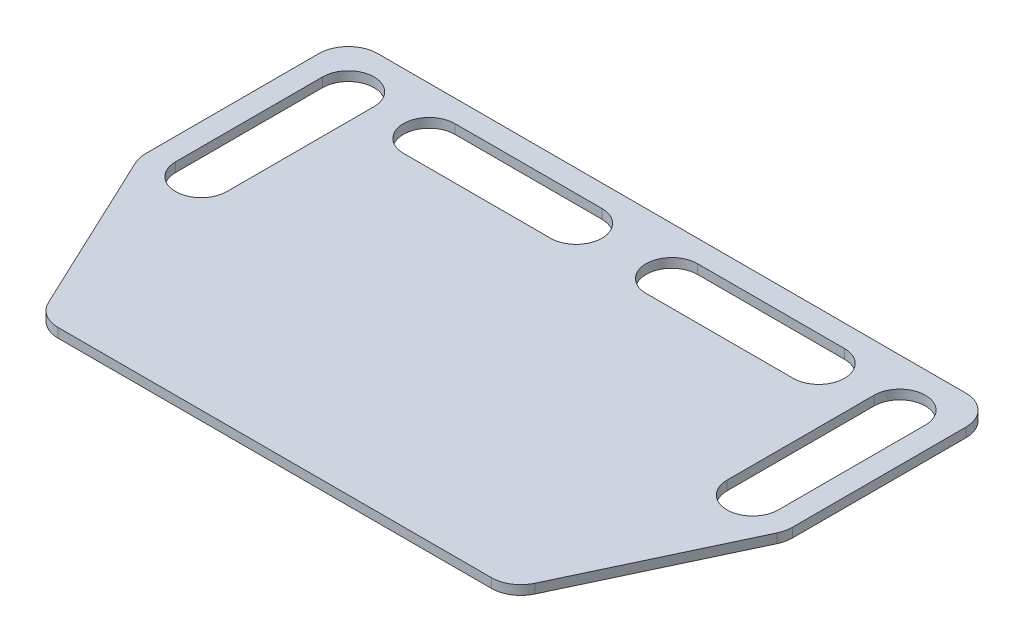
ISO-10303-21;
HEADER;
FILE_DESCRIPTION(('STEP AP214'),'2;1');
FILE_NAME('part.step','',(''),(''),'','','');
FILE_SCHEMA(('AUTOMOTIVE_DESIGN { 1 0 10303 214 1 1 1 1 }'));
ENDSEC;
DATA;
#1=APPLICATION_CONTEXT('core data for automotive mechanical design processes');
#2=APPLICATION_PROTOCOL_DEFINITION('international standard','automotive_design',2000,#1);
#3=PRODUCT_CONTEXT('',#1,'mechanical');
#4=PRODUCT('Part','Part','',(#3));
#5=PRODUCT_RELATED_PRODUCT_CATEGORY('part','',(#4));
#6=PRODUCT_DEFINITION_FORMATION('','',#4);
#7=PRODUCT_DEFINITION_CONTEXT('part definition',#1,'design');
#8=PRODUCT_DEFINITION('design','',#6,#7);
#9=PRODUCT_DEFINITION_SHAPE('','',#8);
#10=(LENGTH_UNIT() NAMED_UNIT(*) SI_UNIT(.MILLI.,.METRE.));
#11=(NAMED_UNIT(*) PLANE_ANGLE_UNIT() SI_UNIT($,.RADIAN.));
#12=(NAMED_UNIT(*) SI_UNIT($,.STERADIAN.) SOLID_ANGLE_UNIT());
#13=UNCERTAINTY_MEASURE_WITH_UNIT(LENGTH_MEASURE(1.E-05),#10,'distance_accuracy_value','');
#14=(GEOMETRIC_REPRESENTATION_CONTEXT(3) GLOBAL_UNCERTAINTY_ASSIGNED_CONTEXT((#13)) GLOBAL_UNIT_ASSIGNED_CONTEXT((#10,
#11,#12)) REPRESENTATION_CONTEXT('',''));
#15=CARTESIAN_POINT('',(0.,0.,0.));
#16=DIRECTION('',(0.,0.,1.));
#17=DIRECTION('',(1.,0.,0.));
#18=AXIS2_PLACEMENT_3D('',#15,#16,#17);
#19=CARTESIAN_POINT('',(-200.,6.35,-21.97073557014));
#20=DIRECTION('',(0.,-1.,0.));
#21=DIRECTION('',(0.,0.,-1.));
#22=AXIS2_PLACEMENT_3D('',#19,#20,#21);
#23=PLANE('',#22);
#24=CARTESIAN_POINT('',(187.5,6.35,-127.5));
#25=DIRECTION('',(0.,1.,0.));
#26=DIRECTION('',(0.,0.,1.));
#27=AXIS2_PLACEMENT_3D('',#24,#25,#26);
#28=CIRCLE('',#27,17.5);
#29=CARTESIAN_POINT('',(205.,6.35,-127.5));
#30=VERTEX_POINT('',#29);
#31=CARTESIAN_POINT('',(170.,6.35,-127.5));
#32=VERTEX_POINT('',#31);
#33=EDGE_CURVE('E254',#30,#32,#28,.T.);
#34=ORIENTED_EDGE('',*,*,#33,.F.);
#35=DIRECTION('',(0.,0.,-1.));
#36=VECTOR('',#35,1.);
#37=CARTESIAN_POINT('',(205.,6.35,-127.5));
#38=LINE('',#37,#36);
#39=CARTESIAN_POINT('',(205.,6.35,-27.5000000000001));
#40=VERTEX_POINT('',#39);
#41=EDGE_CURVE('E262',#40,#30,#38,.T.);
#42=ORIENTED_EDGE('',*,*,#41,.F.);
#43=CARTESIAN_POINT('',(187.5,6.35,-27.5000000000001));
#44=DIRECTION('',(0.,1.,0.));
#45=DIRECTION('',(0.,0.,1.));
#46=AXIS2_PLACEMENT_3D('',#43,#44,#45);
#47=CIRCLE('',#46,17.5);
#48=CARTESIAN_POINT('',(170.,6.35,-27.5000000000001));
#49=VERTEX_POINT('',#48);
#50=EDGE_CURVE('E259',#49,#40,#47,.T.);
#51=ORIENTED_EDGE('',*,*,#50,.F.);
#52=DIRECTION('',(0.,0.,1.));
#53=VECTOR('',#52,1.);
#54=CARTESIAN_POINT('',(170.,6.35,-127.5));
#55=LINE('',#54,#53);
#56=EDGE_CURVE('E256',#32,#49,#55,.T.);
#57=ORIENTED_EDGE('',*,*,#56,.F.);
#58=EDGE_LOOP('',(#34,#42,#51,#57));
#59=FACE_BOUND('',#58,.T.);
#60=CARTESIAN_POINT('',(-187.5,6.35,-127.5));
#61=DIRECTION('',(0.,1.,0.));
#62=DIRECTION('',(0.,0.,1.));
#63=AXIS2_PLACEMENT_3D('',#60,#61,#62);
#64=CIRCLE('',#63,17.5);
#65=CARTESIAN_POINT('',(-170.,6.35,-127.5));
#66=VERTEX_POINT('',#65);
#67=CARTESIAN_POINT('',(-205.,6.35,-127.5));
#68=VERTEX_POINT('',#67);
#69=EDGE_CURVE('E316',#66,#68,#64,.T.);
#70=ORIENTED_EDGE('',*,*,#69,.F.);
#71=DIRECTION('',(0.,0.,-1.));
#72=VECTOR('',#71,1.);
#73=CARTESIAN_POINT('',(-170.,6.35,-127.5));
#74=LINE('',#73,#72);
#75=CARTESIAN_POINT('',(-170.,6.35,-27.5000000000001));
#76=VERTEX_POINT('',#75);
#77=EDGE_CURVE('E324',#76,#66,#74,.T.);
#78=ORIENTED_EDGE('',*,*,#77,.F.);
#79=CARTESIAN_POINT('',(-187.5,6.35,-27.5000000000001));
#80=DIRECTION('',(0.,1.,0.));
#81=DIRECTION('',(0.,0.,1.));
#82=AXIS2_PLACEMENT_3D('',#79,#80,#81);
#83=CIRCLE('',#82,17.5);
#84=CARTESIAN_POINT('',(-205.,6.35,-27.5000000000002));
#85=VERTEX_POINT('',#84);
#86=EDGE_CURVE('E321',#85,#76,#83,.T.);
#87=ORIENTED_EDGE('',*,*,#86,.F.);
#88=DIRECTION('',(0.,0.,1.));
#89=VECTOR('',#88,1.);
#90=CARTESIAN_POINT('',(-205.,6.35,-127.5));
#91=LINE('',#90,#89);
#92=EDGE_CURVE('E318',#68,#85,#91,.T.);
#93=ORIENTED_EDGE('',*,*,#92,.F.);
#94=EDGE_LOOP('',(#70,#78,#87,#93));
#95=FACE_BOUND('',#94,.T.);
#96=CARTESIAN_POINT('',(-200.,6.35,-21.97073557014));
#97=DIRECTION('',(0.,1.,0.));
#98=DIRECTION('',(0.,0.,-1.));
#99=AXIS2_PLACEMENT_3D('',#96,#97,#98);
#100=CIRCLE('',#99,20.);
#101=CARTESIAN_POINT('',(-220.,6.35,-21.97073557014));
#102=VERTEX_POINT('',#101);
#103=CARTESIAN_POINT('',(-218.09637404402,6.35,-13.4547948435424));
#104=VERTEX_POINT('',#103);
#105=EDGE_CURVE('E347',#102,#104,#100,.T.);
#106=ORIENTED_EDGE('',*,*,#105,.T.);
#107=DIRECTION('',(0.42579703632988,0.,0.904818702200994));
#108=VECTOR('',#107,1.);
#109=CARTESIAN_POINT('',(-165.404263187483,6.35,98.5159407265976));
#110=LINE('',#109,#108);
#111=CARTESIAN_POINT('',(-165.404263187483,6.35,98.5159407265976));
#112=VERTEX_POINT('',#111);
#113=EDGE_CURVE('E350',#104,#112,#110,.T.);
#114=ORIENTED_EDGE('',*,*,#113,.T.);
#115=CARTESIAN_POINT('',(-147.307889143464,6.35,90.));
#116=DIRECTION('',(0.,1.,0.));
#117=DIRECTION('',(0.,0.,-1.));
#118=AXIS2_PLACEMENT_3D('',#115,#116,#117);
#119=CIRCLE('',#118,20.);
#120=CARTESIAN_POINT('',(-147.307889143464,6.35,110.));
#121=VERTEX_POINT('',#120);
#122=EDGE_CURVE('E353',#112,#121,#119,.T.);
#123=ORIENTED_EDGE('',*,*,#122,.T.);
#124=DIRECTION('',(1.,0.,0.));
#125=VECTOR('',#124,1.);
#126=CARTESIAN_POINT('',(-147.307889143464,6.35,110.));
#127=LINE('',#126,#125);
#128=CARTESIAN_POINT('',(147.307889143464,6.35,110.));
#129=VERTEX_POINT('',#128);
#130=EDGE_CURVE('E355',#121,#129,#127,.T.);
#131=ORIENTED_EDGE('',*,*,#130,.T.);
#132=CARTESIAN_POINT('',(147.307889143464,6.35,90.));
#133=DIRECTION('',(0.,1.,0.));
#134=DIRECTION('',(0.,0.,-1.));
#135=AXIS2_PLACEMENT_3D('',#132,#133,#134);
#136=CIRCLE('',#135,20.);
#137=CARTESIAN_POINT('',(165.404263187483,6.35,98.5159407265976));
#138=VERTEX_POINT('',#137);
#139=EDGE_CURVE('E357',#129,#138,#136,.T.);
#140=ORIENTED_EDGE('',*,*,#139,.T.);
#141=DIRECTION('',(0.425797036329881,0.,-0.904818702200993));
#142=VECTOR('',#141,1.);
#143=CARTESIAN_POINT('',(165.404263187483,6.35,98.5159407265976));
#144=LINE('',#143,#142);
#145=CARTESIAN_POINT('',(218.09637404402,6.35,-13.4547948435424));
#146=VERTEX_POINT('',#145);
#147=EDGE_CURVE('E359',#138,#146,#144,.T.);
#148=ORIENTED_EDGE('',*,*,#147,.T.);
#149=CARTESIAN_POINT('',(200.,6.35,-21.9707355701401));
#150=DIRECTION('',(0.,1.,0.));
#151=DIRECTION('',(0.,0.,-1.));
#152=AXIS2_PLACEMENT_3D('',#149,#150,#151);
#153=CIRCLE('',#152,20.);
#154=CARTESIAN_POINT('',(220.,6.35,-21.9707355701401));
#155=VERTEX_POINT('',#154);
#156=EDGE_CURVE('E361',#146,#155,#153,.T.);
#157=ORIENTED_EDGE('',*,*,#156,.T.);
#158=DIRECTION('',(0.,0.,-1.));
#159=VECTOR('',#158,1.);
#160=CARTESIAN_POINT('',(220.,6.35,-21.9707355701401));
#161=LINE('',#160,#159);
#162=CARTESIAN_POINT('',(220.,6.35,-140.));
#163=VERTEX_POINT('',#162);
#164=EDGE_CURVE('E363',#155,#163,#161,.T.);
#165=ORIENTED_EDGE('',*,*,#164,.T.);
#166=CARTESIAN_POINT('',(200.,6.35,-140.));
#167=DIRECTION('',(0.,1.,0.));
#168=DIRECTION('',(0.,0.,1.));
#169=AXIS2_PLACEMENT_3D('',#166,#167,#168);
#170=CIRCLE('',#169,20.);
#171=CARTESIAN_POINT('',(200.,6.35,-160.));
#172=VERTEX_POINT('',#171);
#173=EDGE_CURVE('E365',#163,#172,#170,.T.);
#174=ORIENTED_EDGE('',*,*,#173,.T.);
#175=DIRECTION('',(-1.,0.,0.));
#176=VECTOR('',#175,1.);
#177=CARTESIAN_POINT('',(-200.,6.35,-160.));
#178=LINE('',#177,#176);
#179=CARTESIAN_POINT('',(-200.,6.35,-160.));
#180=VERTEX_POINT('',#179);
#181=EDGE_CURVE('E367',#172,#180,#178,.T.);
#182=ORIENTED_EDGE('',*,*,#181,.T.);
#183=CARTESIAN_POINT('',(-200.,6.35,-140.));
#184=DIRECTION('',(0.,1.,0.));
#185=DIRECTION('',(0.,0.,-1.));
#186=AXIS2_PLACEMENT_3D('',#183,#184,#185);
#187=CIRCLE('',#186,20.);
#188=CARTESIAN_POINT('',(-220.,6.35,-140.));
#189=VERTEX_POINT('',#188);
#190=EDGE_CURVE('E369',#180,#189,#187,.T.);
#191=ORIENTED_EDGE('',*,*,#190,.T.);
#192=DIRECTION('',(0.,0.,1.));
#193=VECTOR('',#192,1.);
#194=CARTESIAN_POINT('',(-220.,6.35,-21.97073557014));
#195=LINE('',#194,#193);
#196=EDGE_CURVE('E371',#189,#102,#195,.T.);
#197=ORIENTED_EDGE('',*,*,#196,.T.);
#198=EDGE_LOOP('',(#106,#114,#123,#131,#140,#148,#157,#165,#174,#182,#191,#197));
#199=FACE_BOUND('',#198,.T.);
#200=CARTESIAN_POINT('',(-132.5,6.35,-127.5));
#201=DIRECTION('',(0.,1.,0.));
#202=DIRECTION('',(0.,0.,1.));
#203=AXIS2_PLACEMENT_3D('',#200,#201,#202);
#204=CIRCLE('',#203,17.5000000000001);
#205=CARTESIAN_POINT('',(-132.5,6.35,-145.));
#206=VERTEX_POINT('',#205);
#207=CARTESIAN_POINT('',(-132.5,6.35,-110.));
#208=VERTEX_POINT('',#207);
#209=EDGE_CURVE('E285',#206,#208,#204,.T.);
#210=ORIENTED_EDGE('',*,*,#209,.F.);
#211=DIRECTION('',(-1.,0.,0.));
#212=VECTOR('',#211,1.);
#213=CARTESIAN_POINT('',(-132.5,6.35,-145.));
#214=LINE('',#213,#212);
#215=CARTESIAN_POINT('',(-32.4999999999999,6.35,-145.));
#216=VERTEX_POINT('',#215);
#217=EDGE_CURVE('E293',#216,#206,#214,.T.);
#218=ORIENTED_EDGE('',*,*,#217,.F.);
#219=CARTESIAN_POINT('',(-32.4999999999999,6.35,-127.5));
#220=DIRECTION('',(0.,1.,0.));
#221=DIRECTION('',(0.,0.,1.));
#222=AXIS2_PLACEMENT_3D('',#219,#220,#221);
#223=CIRCLE('',#222,17.5000000000001);
#224=CARTESIAN_POINT('',(-32.4999999999999,6.35,-110.));
#225=VERTEX_POINT('',#224);
#226=EDGE_CURVE('E290',#225,#216,#223,.T.);
#227=ORIENTED_EDGE('',*,*,#226,.F.);
#228=DIRECTION('',(1.,0.,0.));
#229=VECTOR('',#228,1.);
#230=CARTESIAN_POINT('',(-132.5,6.35,-110.));
#231=LINE('',#230,#229);
#232=EDGE_CURVE('E287',#208,#225,#231,.T.);
#233=ORIENTED_EDGE('',*,*,#232,.F.);
#234=EDGE_LOOP('',(#210,#218,#227,#233));
#235=FACE_BOUND('',#234,.T.);
#236=CARTESIAN_POINT('',(32.5000000000001,6.35,-127.5));
#237=DIRECTION('',(0.,1.,0.));
#238=DIRECTION('',(0.,0.,1.));
#239=AXIS2_PLACEMENT_3D('',#236,#237,#238);
#240=CIRCLE('',#239,17.5);
#241=CARTESIAN_POINT('',(32.5000000000001,6.35,-145.));
#242=VERTEX_POINT('',#241);
#243=CARTESIAN_POINT('',(32.5000000000001,6.35,-110.));
#244=VERTEX_POINT('',#243);
#245=EDGE_CURVE('E218',#242,#244,#240,.T.);
#246=ORIENTED_EDGE('',*,*,#245,.F.);
#247=DIRECTION('',(-1.,0.,0.));
#248=VECTOR('',#247,1.);
#249=CARTESIAN_POINT('',(32.5000000000001,6.35,-145.));
#250=LINE('',#249,#248);
#251=CARTESIAN_POINT('',(132.5,6.35,-145.));
#252=VERTEX_POINT('',#251);
#253=EDGE_CURVE('E240',#252,#242,#250,.T.);
#254=ORIENTED_EDGE('',*,*,#253,.F.);
#255=CARTESIAN_POINT('',(132.5,6.35,-127.5));
#256=DIRECTION('',(0.,1.,0.));
#257=DIRECTION('',(0.,0.,1.));
#258=AXIS2_PLACEMENT_3D('',#255,#256,#257);
#259=CIRCLE('',#258,17.5);
#260=CARTESIAN_POINT('',(132.5,6.35,-110.));
#261=VERTEX_POINT('',#260);
#262=EDGE_CURVE('E238',#261,#252,#259,.T.);
#263=ORIENTED_EDGE('',*,*,#262,.F.);
#264=DIRECTION('',(1.,0.,0.));
#265=VECTOR('',#264,1.);
#266=CARTESIAN_POINT('',(32.5000000000001,6.35,-110.));
#267=LINE('',#266,#265);
#268=EDGE_CURVE('E226',#244,#261,#267,.T.);
#269=ORIENTED_EDGE('',*,*,#268,.F.);
#270=EDGE_LOOP('',(#246,#254,#263,#269));
#271=FACE_BOUND('',#270,.T.);
#272=ADVANCED_FACE('F33',(#59,#95,#199,#235,#271),#23,.F.);
#273=CARTESIAN_POINT('',(-200.,0.,-21.97073557014));
#274=DIRECTION('',(0.,-1.,0.));
#275=DIRECTION('',(0.,0.,-1.));
#276=AXIS2_PLACEMENT_3D('',#273,#274,#275);
#277=PLANE('',#276);
#278=DIRECTION('',(0.,0.,-1.));
#279=VECTOR('',#278,1.);
#280=CARTESIAN_POINT('',(205.,0.,-127.5));
#281=LINE('',#280,#279);
#282=CARTESIAN_POINT('',(205.,0.,-27.5000000000001));
#283=VERTEX_POINT('',#282);
#284=CARTESIAN_POINT('',(205.,0.,-127.5));
#285=VERTEX_POINT('',#284);
#286=EDGE_CURVE('E257',#283,#285,#281,.T.);
#287=ORIENTED_EDGE('',*,*,#286,.T.);
#288=CARTESIAN_POINT('',(187.5,0.,-127.5));
#289=DIRECTION('',(0.,1.,0.));
#290=DIRECTION('',(0.,0.,1.));
#291=AXIS2_PLACEMENT_3D('',#288,#289,#290);
#292=CIRCLE('',#291,17.5);
#293=CARTESIAN_POINT('',(170.,0.,-127.5));
#294=VERTEX_POINT('',#293);
#295=EDGE_CURVE('E234',#285,#294,#292,.T.);
#296=ORIENTED_EDGE('',*,*,#295,.T.);
#297=DIRECTION('',(0.,0.,1.));
#298=VECTOR('',#297,1.);
#299=CARTESIAN_POINT('',(170.,0.,-127.5));
#300=LINE('',#299,#298);
#301=CARTESIAN_POINT('',(170.,0.,-27.5000000000001));
#302=VERTEX_POINT('',#301);
#303=EDGE_CURVE('E267',#294,#302,#300,.T.);
#304=ORIENTED_EDGE('',*,*,#303,.T.);
#305=CARTESIAN_POINT('',(187.5,0.,-27.5000000000001));
#306=DIRECTION('',(0.,1.,0.));
#307=DIRECTION('',(0.,0.,1.));
#308=AXIS2_PLACEMENT_3D('',#305,#306,#307);
#309=CIRCLE('',#308,17.5);
#310=EDGE_CURVE('E270',#302,#283,#309,.T.);
#311=ORIENTED_EDGE('',*,*,#310,.T.);
#312=EDGE_LOOP('',(#287,#296,#304,#311));
#313=FACE_BOUND('',#312,.T.);
#314=DIRECTION('',(0.,0.,-1.));
#315=VECTOR('',#314,1.);
#316=CARTESIAN_POINT('',(-170.,0.,-127.5));
#317=LINE('',#316,#315);
#318=CARTESIAN_POINT('',(-170.,0.,-27.5000000000001));
#319=VERTEX_POINT('',#318);
#320=CARTESIAN_POINT('',(-170.,0.,-127.5));
#321=VERTEX_POINT('',#320);
#322=EDGE_CURVE('E319',#319,#321,#317,.T.);
#323=ORIENTED_EDGE('',*,*,#322,.T.);
#324=CARTESIAN_POINT('',(-187.5,0.,-127.5));
#325=DIRECTION('',(0.,1.,0.));
#326=DIRECTION('',(0.,0.,1.));
#327=AXIS2_PLACEMENT_3D('',#324,#325,#326);
#328=CIRCLE('',#327,17.5);
#329=CARTESIAN_POINT('',(-205.,0.,-127.5));
#330=VERTEX_POINT('',#329);
#331=EDGE_CURVE('E315',#321,#330,#328,.T.);
#332=ORIENTED_EDGE('',*,*,#331,.T.);
#333=DIRECTION('',(0.,0.,1.));
#334=VECTOR('',#333,1.);
#335=CARTESIAN_POINT('',(-205.,0.,-127.5));
#336=LINE('',#335,#334);
#337=CARTESIAN_POINT('',(-205.,0.,-27.5000000000002));
#338=VERTEX_POINT('',#337);
#339=EDGE_CURVE('E329',#330,#338,#336,.T.);
#340=ORIENTED_EDGE('',*,*,#339,.T.);
#341=CARTESIAN_POINT('',(-187.5,0.,-27.5000000000001));
#342=DIRECTION('',(0.,1.,0.));
#343=DIRECTION('',(0.,0.,1.));
#344=AXIS2_PLACEMENT_3D('',#341,#342,#343);
#345=CIRCLE('',#344,17.5);
#346=EDGE_CURVE('E332',#338,#319,#345,.T.);
#347=ORIENTED_EDGE('',*,*,#346,.T.);
#348=EDGE_LOOP('',(#323,#332,#340,#347));
#349=FACE_BOUND('',#348,.T.);
#350=CARTESIAN_POINT('',(-200.,0.,-21.97073557014));
#351=DIRECTION('',(0.,1.,0.));
#352=DIRECTION('',(0.,0.,-1.));
#353=AXIS2_PLACEMENT_3D('',#350,#351,#352);
#354=CIRCLE('',#353,20.);
#355=CARTESIAN_POINT('',(-220.,0.,-21.97073557014));
#356=VERTEX_POINT('',#355);
#357=CARTESIAN_POINT('',(-218.09637404402,0.,-13.4547948435424));
#358=VERTEX_POINT('',#357);
#359=EDGE_CURVE('E346',#356,#358,#354,.T.);
#360=ORIENTED_EDGE('',*,*,#359,.F.);
#361=DIRECTION('',(0.,0.,1.));
#362=VECTOR('',#361,1.);
#363=CARTESIAN_POINT('',(-220.,0.,-21.97073557014));
#364=LINE('',#363,#362);
#365=CARTESIAN_POINT('',(-220.,0.,-140.));
#366=VERTEX_POINT('',#365);
#367=EDGE_CURVE('E351',#366,#356,#364,.T.);
#368=ORIENTED_EDGE('',*,*,#367,.F.);
#369=CARTESIAN_POINT('',(-200.,0.,-140.));
#370=DIRECTION('',(0.,1.,0.));
#371=DIRECTION('',(0.,0.,-1.));
#372=AXIS2_PLACEMENT_3D('',#369,#370,#371);
#373=CIRCLE('',#372,20.);
#374=CARTESIAN_POINT('',(-200.,0.,-160.));
#375=VERTEX_POINT('',#374);
#376=EDGE_CURVE('E394',#375,#366,#373,.T.);
#377=ORIENTED_EDGE('',*,*,#376,.F.);
#378=DIRECTION('',(-1.,0.,0.));
#379=VECTOR('',#378,1.);
#380=CARTESIAN_POINT('',(-200.,0.,-160.));
#381=LINE('',#380,#379);
#382=CARTESIAN_POINT('',(200.,0.,-160.));
#383=VERTEX_POINT('',#382);
#384=EDGE_CURVE('E392',#383,#375,#381,.T.);
#385=ORIENTED_EDGE('',*,*,#384,.F.);
#386=CARTESIAN_POINT('',(200.,0.,-140.));
#387=DIRECTION('',(0.,1.,0.));
#388=DIRECTION('',(0.,0.,1.));
#389=AXIS2_PLACEMENT_3D('',#386,#387,#388);
#390=CIRCLE('',#389,20.);
#391=CARTESIAN_POINT('',(220.,0.,-140.));
#392=VERTEX_POINT('',#391);
#393=EDGE_CURVE('E390',#392,#383,#390,.T.);
#394=ORIENTED_EDGE('',*,*,#393,.F.);
#395=DIRECTION('',(0.,0.,-1.));
#396=VECTOR('',#395,1.);
#397=CARTESIAN_POINT('',(220.,0.,-21.9707355701401));
#398=LINE('',#397,#396);
#399=CARTESIAN_POINT('',(220.,0.,-21.9707355701401));
#400=VERTEX_POINT('',#399);
#401=EDGE_CURVE('E388',#400,#392,#398,.T.);
#402=ORIENTED_EDGE('',*,*,#401,.F.);
#403=CARTESIAN_POINT('',(200.,0.,-21.9707355701401));
#404=DIRECTION('',(0.,1.,0.));
#405=DIRECTION('',(0.,0.,-1.));
#406=AXIS2_PLACEMENT_3D('',#403,#404,#405);
#407=CIRCLE('',#406,20.);
#408=CARTESIAN_POINT('',(218.09637404402,0.,-13.4547948435424));
#409=VERTEX_POINT('',#408);
#410=EDGE_CURVE('E386',#409,#400,#407,.T.);
#411=ORIENTED_EDGE('',*,*,#410,.F.);
#412=DIRECTION('',(0.425797036329881,0.,-0.904818702200993));
#413=VECTOR('',#412,1.);
#414=CARTESIAN_POINT('',(165.404263187483,0.,98.5159407265976));
#415=LINE('',#414,#413);
#416=CARTESIAN_POINT('',(165.404263187483,0.,98.5159407265976));
#417=VERTEX_POINT('',#416);
#418=EDGE_CURVE('E384',#417,#409,#415,.T.);
#419=ORIENTED_EDGE('',*,*,#418,.F.);
#420=CARTESIAN_POINT('',(147.307889143464,0.,90.));
#421=DIRECTION('',(0.,1.,0.));
#422=DIRECTION('',(0.,0.,-1.));
#423=AXIS2_PLACEMENT_3D('',#420,#421,#422);
#424=CIRCLE('',#423,20.);
#425=CARTESIAN_POINT('',(147.307889143464,0.,110.));
#426=VERTEX_POINT('',#425);
#427=EDGE_CURVE('E382',#426,#417,#424,.T.);
#428=ORIENTED_EDGE('',*,*,#427,.F.);
#429=DIRECTION('',(1.,0.,0.));
#430=VECTOR('',#429,1.);
#431=CARTESIAN_POINT('',(-147.307889143464,0.,110.));
#432=LINE('',#431,#430);
#433=CARTESIAN_POINT('',(-147.307889143464,0.,110.));
#434=VERTEX_POINT('',#433);
#435=EDGE_CURVE('E380',#434,#426,#432,.T.);
#436=ORIENTED_EDGE('',*,*,#435,.F.);
#437=CARTESIAN_POINT('',(-147.307889143464,0.,90.));
#438=DIRECTION('',(0.,1.,0.));
#439=DIRECTION('',(0.,0.,-1.));
#440=AXIS2_PLACEMENT_3D('',#437,#438,#439);
#441=CIRCLE('',#440,20.);
#442=CARTESIAN_POINT('',(-165.404263187483,0.,98.5159407265976));
#443=VERTEX_POINT('',#442);
#444=EDGE_CURVE('E378',#443,#434,#441,.T.);
#445=ORIENTED_EDGE('',*,*,#444,.F.);
#446=DIRECTION('',(0.42579703632988,0.,0.904818702200994));
#447=VECTOR('',#446,1.);
#448=CARTESIAN_POINT('',(-165.404263187483,0.,98.5159407265976));
#449=LINE('',#448,#447);
#450=EDGE_CURVE('E376',#358,#443,#449,.T.);
#451=ORIENTED_EDGE('',*,*,#450,.F.);
#452=EDGE_LOOP('',(#360,#368,#377,#385,#394,#402,#411,#419,#428,#436,#445,#451));
#453=FACE_BOUND('',#452,.T.);
#454=DIRECTION('',(-1.,0.,0.));
#455=VECTOR('',#454,1.);
#456=CARTESIAN_POINT('',(-132.5,0.,-145.));
#457=LINE('',#456,#455);
#458=CARTESIAN_POINT('',(-32.4999999999999,0.,-145.));
#459=VERTEX_POINT('',#458);
#460=CARTESIAN_POINT('',(-132.5,0.,-145.));
#461=VERTEX_POINT('',#460);
#462=EDGE_CURVE('E288',#459,#461,#457,.T.);
#463=ORIENTED_EDGE('',*,*,#462,.T.);
#464=CARTESIAN_POINT('',(-132.5,0.,-127.5));
#465=DIRECTION('',(0.,1.,0.));
#466=DIRECTION('',(0.,0.,1.));
#467=AXIS2_PLACEMENT_3D('',#464,#465,#466);
#468=CIRCLE('',#467,17.5000000000001);
#469=CARTESIAN_POINT('',(-132.5,0.,-110.));
#470=VERTEX_POINT('',#469);
#471=EDGE_CURVE('E284',#461,#470,#468,.T.);
#472=ORIENTED_EDGE('',*,*,#471,.T.);
#473=DIRECTION('',(1.,0.,0.));
#474=VECTOR('',#473,1.);
#475=CARTESIAN_POINT('',(-132.5,0.,-110.));
#476=LINE('',#475,#474);
#477=CARTESIAN_POINT('',(-32.4999999999999,0.,-110.));
#478=VERTEX_POINT('',#477);
#479=EDGE_CURVE('E298',#470,#478,#476,.T.);
#480=ORIENTED_EDGE('',*,*,#479,.T.);
#481=CARTESIAN_POINT('',(-32.4999999999999,0.,-127.5));
#482=DIRECTION('',(0.,1.,0.));
#483=DIRECTION('',(0.,0.,1.));
#484=AXIS2_PLACEMENT_3D('',#481,#482,#483);
#485=CIRCLE('',#484,17.5000000000001);
#486=EDGE_CURVE('E301',#478,#459,#485,.T.);
#487=ORIENTED_EDGE('',*,*,#486,.T.);
#488=EDGE_LOOP('',(#463,#472,#480,#487));
#489=FACE_BOUND('',#488,.T.);
#490=DIRECTION('',(-1.,0.,0.));
#491=VECTOR('',#490,1.);
#492=CARTESIAN_POINT('',(32.5000000000001,0.,-145.));
#493=LINE('',#492,#491);
#494=CARTESIAN_POINT('',(132.5,0.,-145.));
#495=VERTEX_POINT('',#494);
#496=CARTESIAN_POINT('',(32.5000000000001,0.,-145.));
#497=VERTEX_POINT('',#496);
#498=EDGE_CURVE('E227',#495,#497,#493,.T.);
#499=ORIENTED_EDGE('',*,*,#498,.T.);
#500=CARTESIAN_POINT('',(32.5000000000001,0.,-127.5));
#501=DIRECTION('',(0.,1.,0.));
#502=DIRECTION('',(0.,0.,1.));
#503=AXIS2_PLACEMENT_3D('',#500,#501,#502);
#504=CIRCLE('',#503,17.5);
#505=CARTESIAN_POINT('',(32.5000000000001,0.,-110.));
#506=VERTEX_POINT('',#505);
#507=EDGE_CURVE('E56',#497,#506,#504,.T.);
#508=ORIENTED_EDGE('',*,*,#507,.T.);
#509=DIRECTION('',(1.,0.,0.));
#510=VECTOR('',#509,1.);
#511=CARTESIAN_POINT('',(32.5000000000001,0.,-110.));
#512=LINE('',#511,#510);
#513=CARTESIAN_POINT('',(132.5,0.,-110.));
#514=VERTEX_POINT('',#513);
#515=EDGE_CURVE('E233',#506,#514,#512,.T.);
#516=ORIENTED_EDGE('',*,*,#515,.T.);
#517=CARTESIAN_POINT('',(132.5,0.,-127.5));
#518=DIRECTION('',(0.,1.,0.));
#519=DIRECTION('',(0.,0.,1.));
#520=AXIS2_PLACEMENT_3D('',#517,#518,#519);
#521=CIRCLE('',#520,17.5);
#522=EDGE_CURVE('E246',#514,#495,#521,.T.);
#523=ORIENTED_EDGE('',*,*,#522,.T.);
#524=EDGE_LOOP('',(#499,#508,#516,#523));
#525=FACE_BOUND('',#524,.T.);
#526=ADVANCED_FACE('F436',(#313,#349,#453,#489,#525),#277,.T.);
#527=CARTESIAN_POINT('',(-200.,6.35,-21.97073557014));
#528=DIRECTION('',(0.,-1.,0.));
#529=DIRECTION('',(0.,0.,-1.));
#530=AXIS2_PLACEMENT_3D('',#527,#528,#529);
#531=CYLINDRICAL_SURFACE('',#530,20.);
#532=ORIENTED_EDGE('',*,*,#359,.T.);
#533=DIRECTION('',(0.,-1.,0.));
#534=VECTOR('',#533,1.);
#535=CARTESIAN_POINT('',(-218.09637404402,6.35,-13.4547948435424));
#536=LINE('',#535,#534);
#537=EDGE_CURVE('E11',#104,#358,#536,.T.);
#538=ORIENTED_EDGE('',*,*,#537,.F.);
#539=ORIENTED_EDGE('',*,*,#105,.F.);
#540=DIRECTION('',(0.,-1.,0.));
#541=VECTOR('',#540,1.);
#542=CARTESIAN_POINT('',(-220.,6.35,-21.97073557014));
#543=LINE('',#542,#541);
#544=EDGE_CURVE('E373',#102,#356,#543,.T.);
#545=ORIENTED_EDGE('',*,*,#544,.T.);
#546=EDGE_LOOP('',(#532,#538,#539,#545));
#547=FACE_BOUND('',#546,.T.);
#548=ADVANCED_FACE('F35',(#547),#531,.T.);
#549=CARTESIAN_POINT('',(-165.404263187483,6.35,98.5159407265976));
#550=DIRECTION('',(0.904818702200994,0.,-0.42579703632988));
#551=DIRECTION('',(-0.42579703632988,0.,-0.904818702200994));
#552=AXIS2_PLACEMENT_3D('',#549,#550,#551);
#553=PLANE('',#552);
#554=ORIENTED_EDGE('',*,*,#450,.T.);
#555=DIRECTION('',(0.,-1.,0.));
#556=VECTOR('',#555,1.);
#557=CARTESIAN_POINT('',(-165.404263187483,6.35,98.5159407265976));
#558=LINE('',#557,#556);
#559=EDGE_CURVE('E41',#112,#443,#558,.T.);
#560=ORIENTED_EDGE('',*,*,#559,.F.);
#561=ORIENTED_EDGE('',*,*,#113,.F.);
#562=ORIENTED_EDGE('',*,*,#537,.T.);
#563=EDGE_LOOP('',(#554,#560,#561,#562));
#564=FACE_BOUND('',#563,.T.);
#565=ADVANCED_FACE('F454',(#564),#553,.F.);
#566=CARTESIAN_POINT('',(-147.307889143464,6.35,90.));
#567=DIRECTION('',(0.,-1.,0.));
#568=DIRECTION('',(0.,0.,-1.));
#569=AXIS2_PLACEMENT_3D('',#566,#567,#568);
#570=CYLINDRICAL_SURFACE('',#569,20.);
#571=ORIENTED_EDGE('',*,*,#444,.T.);
#572=DIRECTION('',(0.,-1.,0.));
#573=VECTOR('',#572,1.);
#574=CARTESIAN_POINT('',(-147.307889143464,6.35,110.));
#575=LINE('',#574,#573);
#576=EDGE_CURVE('E423',#121,#434,#575,.T.);
#577=ORIENTED_EDGE('',*,*,#576,.F.);
#578=ORIENTED_EDGE('',*,*,#122,.F.);
#579=ORIENTED_EDGE('',*,*,#559,.T.);
#580=EDGE_LOOP('',(#571,#577,#578,#579));
#581=FACE_BOUND('',#580,.T.);
#582=ADVANCED_FACE('F430',(#581),#570,.T.);
#583=CARTESIAN_POINT('',(-147.307889143464,6.35,110.));
#584=DIRECTION('',(0.,0.,-1.));
#585=DIRECTION('',(-1.,0.,0.));
#586=AXIS2_PLACEMENT_3D('',#583,#584,#585);
#587=PLANE('',#586);
#588=ORIENTED_EDGE('',*,*,#435,.T.);
#589=DIRECTION('',(0.,-1.,0.));
#590=VECTOR('',#589,1.);
#591=CARTESIAN_POINT('',(147.307889143464,6.35,110.));
#592=LINE('',#591,#590);
#593=EDGE_CURVE('E420',#129,#426,#592,.T.);
#594=ORIENTED_EDGE('',*,*,#593,.F.);
#595=ORIENTED_EDGE('',*,*,#130,.F.);
#596=ORIENTED_EDGE('',*,*,#576,.T.);
#597=EDGE_LOOP('',(#588,#594,#595,#596));
#598=FACE_BOUND('',#597,.T.);
#599=ADVANCED_FACE('F442',(#598),#587,.F.);
#600=CARTESIAN_POINT('',(147.307889143464,6.35,90.));
#601=DIRECTION('',(0.,-1.,0.));
#602=DIRECTION('',(0.,0.,-1.));
#603=AXIS2_PLACEMENT_3D('',#600,#601,#602);
#604=CYLINDRICAL_SURFACE('',#603,20.);
#605=ORIENTED_EDGE('',*,*,#427,.T.);
#606=DIRECTION('',(0.,-1.,0.));
#607=VECTOR('',#606,1.);
#608=CARTESIAN_POINT('',(165.404263187483,6.35,98.5159407265976));
#609=LINE('',#608,#607);
#610=EDGE_CURVE('E417',#138,#417,#609,.T.);
#611=ORIENTED_EDGE('',*,*,#610,.F.);
#612=ORIENTED_EDGE('',*,*,#139,.F.);
#613=ORIENTED_EDGE('',*,*,#593,.T.);
#614=EDGE_LOOP('',(#605,#611,#612,#613));
#615=FACE_BOUND('',#614,.T.);
#616=ADVANCED_FACE('F446',(#615),#604,.T.);
#617=CARTESIAN_POINT('',(165.404263187483,6.35,98.5159407265976));
#618=DIRECTION('',(-0.904818702200993,0.,-0.425797036329881));
#619=DIRECTION('',(-0.425797036329881,0.,0.904818702200993));
#620=AXIS2_PLACEMENT_3D('',#617,#618,#619);
#621=PLANE('',#620);
#622=ORIENTED_EDGE('',*,*,#418,.T.);
#623=DIRECTION('',(0.,-1.,0.));
#624=VECTOR('',#623,1.);
#625=CARTESIAN_POINT('',(218.09637404402,6.35,-13.4547948435424));
#626=LINE('',#625,#624);
#627=EDGE_CURVE('E414',#146,#409,#626,.T.);
#628=ORIENTED_EDGE('',*,*,#627,.F.);
#629=ORIENTED_EDGE('',*,*,#147,.F.);
#630=ORIENTED_EDGE('',*,*,#610,.T.);
#631=EDGE_LOOP('',(#622,#628,#629,#630));
#632=FACE_BOUND('',#631,.T.);
#633=ADVANCED_FACE('F487',(#632),#621,.F.);
#634=CARTESIAN_POINT('',(200.,6.35,-21.9707355701401));
#635=DIRECTION('',(0.,-1.,0.));
#636=DIRECTION('',(0.,0.,-1.));
#637=AXIS2_PLACEMENT_3D('',#634,#635,#636);
#638=CYLINDRICAL_SURFACE('',#637,20.);
#639=ORIENTED_EDGE('',*,*,#410,.T.);
#640=DIRECTION('',(0.,-1.,0.));
#641=VECTOR('',#640,1.);
#642=CARTESIAN_POINT('',(220.,6.35,-21.9707355701401));
#643=LINE('',#642,#641);
#644=EDGE_CURVE('E411',#155,#400,#643,.T.);
#645=ORIENTED_EDGE('',*,*,#644,.F.);
#646=ORIENTED_EDGE('',*,*,#156,.F.);
#647=ORIENTED_EDGE('',*,*,#627,.T.);
#648=EDGE_LOOP('',(#639,#645,#646,#647));
#649=FACE_BOUND('',#648,.T.);
#650=ADVANCED_FACE('F485',(#649),#638,.T.);
#651=CARTESIAN_POINT('',(220.,6.35,-21.9707355701401));
#652=DIRECTION('',(-1.,0.,0.));
#653=DIRECTION('',(0.,0.,1.));
#654=AXIS2_PLACEMENT_3D('',#651,#652,#653);
#655=PLANE('',#654);
#656=ORIENTED_EDGE('',*,*,#401,.T.);
#657=DIRECTION('',(0.,-1.,0.));
#658=VECTOR('',#657,1.);
#659=CARTESIAN_POINT('',(220.,6.35,-140.));
#660=LINE('',#659,#658);
#661=EDGE_CURVE('E408',#163,#392,#660,.T.);
#662=ORIENTED_EDGE('',*,*,#661,.F.);
#663=ORIENTED_EDGE('',*,*,#164,.F.);
#664=ORIENTED_EDGE('',*,*,#644,.T.);
#665=EDGE_LOOP('',(#656,#662,#663,#664));
#666=FACE_BOUND('',#665,.T.);
#667=ADVANCED_FACE('F481',(#666),#655,.F.);
#668=CARTESIAN_POINT('',(200.,6.35,-140.));
#669=DIRECTION('',(0.,-1.,0.));
#670=DIRECTION('',(0.,0.,-1.));
#671=AXIS2_PLACEMENT_3D('',#668,#669,#670);
#672=CYLINDRICAL_SURFACE('',#671,20.);
#673=ORIENTED_EDGE('',*,*,#393,.T.);
#674=DIRECTION('',(0.,-1.,0.));
#675=VECTOR('',#674,1.);
#676=CARTESIAN_POINT('',(200.,6.35,-160.));
#677=LINE('',#676,#675);
#678=EDGE_CURVE('E405',#172,#383,#677,.T.);
#679=ORIENTED_EDGE('',*,*,#678,.F.);
#680=ORIENTED_EDGE('',*,*,#173,.F.);
#681=ORIENTED_EDGE('',*,*,#661,.T.);
#682=EDGE_LOOP('',(#673,#679,#680,#681));
#683=FACE_BOUND('',#682,.T.);
#684=ADVANCED_FACE('F476',(#683),#672,.T.);
#685=CARTESIAN_POINT('',(-200.,6.35,-160.));
#686=DIRECTION('',(0.,0.,1.));
#687=DIRECTION('',(1.,0.,0.));
#688=AXIS2_PLACEMENT_3D('',#685,#686,#687);
#689=PLANE('',#688);
#690=ORIENTED_EDGE('',*,*,#384,.T.);
#691=DIRECTION('',(0.,-1.,0.));
#692=VECTOR('',#691,1.);
#693=CARTESIAN_POINT('',(-200.,6.35,-160.));
#694=LINE('',#693,#692);
#695=EDGE_CURVE('E402',#180,#375,#694,.T.);
#696=ORIENTED_EDGE('',*,*,#695,.F.);
#697=ORIENTED_EDGE('',*,*,#181,.F.);
#698=ORIENTED_EDGE('',*,*,#678,.T.);
#699=EDGE_LOOP('',(#690,#696,#697,#698));
#700=FACE_BOUND('',#699,.T.);
#701=ADVANCED_FACE('F470',(#700),#689,.F.);
#702=CARTESIAN_POINT('',(-200.,6.35,-140.));
#703=DIRECTION('',(0.,-1.,0.));
#704=DIRECTION('',(0.,0.,-1.));
#705=AXIS2_PLACEMENT_3D('',#702,#703,#704);
#706=CYLINDRICAL_SURFACE('',#705,20.);
#707=ORIENTED_EDGE('',*,*,#376,.T.);
#708=DIRECTION('',(0.,-1.,0.));
#709=VECTOR('',#708,1.);
#710=CARTESIAN_POINT('',(-220.,6.35,-140.));
#711=LINE('',#710,#709);
#712=EDGE_CURVE('E399',#189,#366,#711,.T.);
#713=ORIENTED_EDGE('',*,*,#712,.F.);
#714=ORIENTED_EDGE('',*,*,#190,.F.);
#715=ORIENTED_EDGE('',*,*,#695,.T.);
#716=EDGE_LOOP('',(#707,#713,#714,#715));
#717=FACE_BOUND('',#716,.T.);
#718=ADVANCED_FACE('F466',(#717),#706,.T.);
#719=CARTESIAN_POINT('',(-220.,6.35,-21.97073557014));
#720=DIRECTION('',(1.,0.,0.));
#721=DIRECTION('',(0.,0.,-1.));
#722=AXIS2_PLACEMENT_3D('',#719,#720,#721);
#723=PLANE('',#722);
#724=ORIENTED_EDGE('',*,*,#367,.T.);
#725=ORIENTED_EDGE('',*,*,#544,.F.);
#726=ORIENTED_EDGE('',*,*,#196,.F.);
#727=ORIENTED_EDGE('',*,*,#712,.T.);
#728=EDGE_LOOP('',(#724,#725,#726,#727));
#729=FACE_BOUND('',#728,.T.);
#730=ADVANCED_FACE('F461',(#729),#723,.F.);
#731=CARTESIAN_POINT('',(-187.5,6.35,-127.5));
#732=DIRECTION('',(0.,-1.,0.));
#733=DIRECTION('',(0.,0.,-1.));
#734=AXIS2_PLACEMENT_3D('',#731,#732,#733);
#735=CYLINDRICAL_SURFACE('',#734,17.5);
#736=ORIENTED_EDGE('',*,*,#331,.F.);
#737=DIRECTION('',(0.,-1.,0.));
#738=VECTOR('',#737,1.);
#739=CARTESIAN_POINT('',(-170.,6.35,-127.5));
#740=LINE('',#739,#738);
#741=EDGE_CURVE('E326',#66,#321,#740,.T.);
#742=ORIENTED_EDGE('',*,*,#741,.F.);
#743=ORIENTED_EDGE('',*,*,#69,.T.);
#744=DIRECTION('',(0.,-1.,0.));
#745=VECTOR('',#744,1.);
#746=CARTESIAN_POINT('',(-205.,6.35,-127.5));
#747=LINE('',#746,#745);
#748=EDGE_CURVE('E343',#68,#330,#747,.T.);
#749=ORIENTED_EDGE('',*,*,#748,.T.);
#750=EDGE_LOOP('',(#736,#742,#743,#749));
#751=FACE_BOUND('',#750,.T.);
#752=ADVANCED_FACE('F507',(#751),#735,.F.);
#753=CARTESIAN_POINT('',(-205.,6.35,-127.5));
#754=DIRECTION('',(1.,0.,0.));
#755=DIRECTION('',(0.,0.,-1.));
#756=AXIS2_PLACEMENT_3D('',#753,#754,#755);
#757=PLANE('',#756);
#758=ORIENTED_EDGE('',*,*,#339,.F.);
#759=ORIENTED_EDGE('',*,*,#748,.F.);
#760=ORIENTED_EDGE('',*,*,#92,.T.);
#761=DIRECTION('',(0.,-1.,0.));
#762=VECTOR('',#761,1.);
#763=CARTESIAN_POINT('',(-205.,6.35,-27.5000000000002));
#764=LINE('',#763,#762);
#765=EDGE_CURVE('E341',#85,#338,#764,.T.);
#766=ORIENTED_EDGE('',*,*,#765,.T.);
#767=EDGE_LOOP('',(#758,#759,#760,#766));
#768=FACE_BOUND('',#767,.T.);
#769=ADVANCED_FACE('F545',(#768),#757,.T.);
#770=CARTESIAN_POINT('',(-187.5,6.35,-27.5000000000001));
#771=DIRECTION('',(0.,-1.,0.));
#772=DIRECTION('',(0.,0.,-1.));
#773=AXIS2_PLACEMENT_3D('',#770,#771,#772);
#774=CYLINDRICAL_SURFACE('',#773,17.5);
#775=ORIENTED_EDGE('',*,*,#346,.F.);
#776=ORIENTED_EDGE('',*,*,#765,.F.);
#777=ORIENTED_EDGE('',*,*,#86,.T.);
#778=DIRECTION('',(0.,-1.,0.));
#779=VECTOR('',#778,1.);
#780=CARTESIAN_POINT('',(-170.,6.35,-27.5000000000001));
#781=LINE('',#780,#779);
#782=EDGE_CURVE('E339',#76,#319,#781,.T.);
#783=ORIENTED_EDGE('',*,*,#782,.T.);
#784=EDGE_LOOP('',(#775,#776,#777,#783));
#785=FACE_BOUND('',#784,.T.);
#786=ADVANCED_FACE('F552',(#785),#774,.F.);
#787=CARTESIAN_POINT('',(-170.,6.35,-127.5));
#788=DIRECTION('',(-1.,0.,0.));
#789=DIRECTION('',(0.,0.,1.));
#790=AXIS2_PLACEMENT_3D('',#787,#788,#789);
#791=PLANE('',#790);
#792=ORIENTED_EDGE('',*,*,#322,.F.);
#793=ORIENTED_EDGE('',*,*,#782,.F.);
#794=ORIENTED_EDGE('',*,*,#77,.T.);
#795=ORIENTED_EDGE('',*,*,#741,.T.);
#796=EDGE_LOOP('',(#792,#793,#794,#795));
#797=FACE_BOUND('',#796,.T.);
#798=ADVANCED_FACE('F559',(#797),#791,.T.);
#799=CARTESIAN_POINT('',(-132.5,6.35,-127.5));
#800=DIRECTION('',(0.,-1.,0.));
#801=DIRECTION('',(0.,0.,-1.));
#802=AXIS2_PLACEMENT_3D('',#799,#800,#801);
#803=CYLINDRICAL_SURFACE('',#802,17.5000000000001);
#804=ORIENTED_EDGE('',*,*,#471,.F.);
#805=DIRECTION('',(0.,-1.,0.));
#806=VECTOR('',#805,1.);
#807=CARTESIAN_POINT('',(-132.5,6.35,-145.));
#808=LINE('',#807,#806);
#809=EDGE_CURVE('E295',#206,#461,#808,.T.);
#810=ORIENTED_EDGE('',*,*,#809,.F.);
#811=ORIENTED_EDGE('',*,*,#209,.T.);
#812=DIRECTION('',(0.,-1.,0.));
#813=VECTOR('',#812,1.);
#814=CARTESIAN_POINT('',(-132.5,6.35,-110.));
#815=LINE('',#814,#813);
#816=EDGE_CURVE('E312',#208,#470,#815,.T.);
#817=ORIENTED_EDGE('',*,*,#816,.T.);
#818=EDGE_LOOP('',(#804,#810,#811,#817));
#819=FACE_BOUND('',#818,.T.);
#820=ADVANCED_FACE('F567',(#819),#803,.F.);
#821=CARTESIAN_POINT('',(-132.5,6.35,-110.));
#822=DIRECTION('',(0.,0.,-1.));
#823=DIRECTION('',(-1.,0.,0.));
#824=AXIS2_PLACEMENT_3D('',#821,#822,#823);
#825=PLANE('',#824);
#826=ORIENTED_EDGE('',*,*,#479,.F.);
#827=ORIENTED_EDGE('',*,*,#816,.F.);
#828=ORIENTED_EDGE('',*,*,#232,.T.);
#829=DIRECTION('',(0.,-1.,0.));
#830=VECTOR('',#829,1.);
#831=CARTESIAN_POINT('',(-32.4999999999999,6.35,-110.));
#832=LINE('',#831,#830);
#833=EDGE_CURVE('E310',#225,#478,#832,.T.);
#834=ORIENTED_EDGE('',*,*,#833,.T.);
#835=EDGE_LOOP('',(#826,#827,#828,#834));
#836=FACE_BOUND('',#835,.T.);
#837=ADVANCED_FACE('F575',(#836),#825,.T.);
#838=CARTESIAN_POINT('',(-32.4999999999999,6.35,-127.5));
#839=DIRECTION('',(0.,-1.,0.));
#840=DIRECTION('',(0.,0.,-1.));
#841=AXIS2_PLACEMENT_3D('',#838,#839,#840);
#842=CYLINDRICAL_SURFACE('',#841,17.5000000000001);
#843=ORIENTED_EDGE('',*,*,#486,.F.);
#844=ORIENTED_EDGE('',*,*,#833,.F.);
#845=ORIENTED_EDGE('',*,*,#226,.T.);
#846=DIRECTION('',(0.,-1.,0.));
#847=VECTOR('',#846,1.);
#848=CARTESIAN_POINT('',(-32.4999999999999,6.35,-145.));
#849=LINE('',#848,#847);
#850=EDGE_CURVE('E308',#216,#459,#849,.T.);
#851=ORIENTED_EDGE('',*,*,#850,.T.);
#852=EDGE_LOOP('',(#843,#844,#845,#851));
#853=FACE_BOUND('',#852,.T.);
#854=ADVANCED_FACE('F583',(#853),#842,.F.);
#855=CARTESIAN_POINT('',(-132.5,6.35,-145.));
#856=DIRECTION('',(0.,0.,1.));
#857=DIRECTION('',(1.,0.,0.));
#858=AXIS2_PLACEMENT_3D('',#855,#856,#857);
#859=PLANE('',#858);
#860=ORIENTED_EDGE('',*,*,#462,.F.);
#861=ORIENTED_EDGE('',*,*,#850,.F.);
#862=ORIENTED_EDGE('',*,*,#217,.T.);
#863=ORIENTED_EDGE('',*,*,#809,.T.);
#864=EDGE_LOOP('',(#860,#861,#862,#863));
#865=FACE_BOUND('',#864,.T.);
#866=ADVANCED_FACE('F591',(#865),#859,.T.);
#867=CARTESIAN_POINT('',(187.5,6.35,-127.5));
#868=DIRECTION('',(0.,-1.,0.));
#869=DIRECTION('',(0.,0.,-1.));
#870=AXIS2_PLACEMENT_3D('',#867,#868,#869);
#871=CYLINDRICAL_SURFACE('',#870,17.5);
#872=ORIENTED_EDGE('',*,*,#295,.F.);
#873=DIRECTION('',(0.,-1.,0.));
#874=VECTOR('',#873,1.);
#875=CARTESIAN_POINT('',(205.,6.35,-127.5));
#876=LINE('',#875,#874);
#877=EDGE_CURVE('E264',#30,#285,#876,.T.);
#878=ORIENTED_EDGE('',*,*,#877,.F.);
#879=ORIENTED_EDGE('',*,*,#33,.T.);
#880=DIRECTION('',(0.,-1.,0.));
#881=VECTOR('',#880,1.);
#882=CARTESIAN_POINT('',(170.,6.35,-127.5));
#883=LINE('',#882,#881);
#884=EDGE_CURVE('E281',#32,#294,#883,.T.);
#885=ORIENTED_EDGE('',*,*,#884,.T.);
#886=EDGE_LOOP('',(#872,#878,#879,#885));
#887=FACE_BOUND('',#886,.T.);
#888=ADVANCED_FACE('F599',(#887),#871,.F.);
#889=CARTESIAN_POINT('',(170.,6.35,-127.5));
#890=DIRECTION('',(1.,0.,0.));
#891=DIRECTION('',(0.,0.,-1.));
#892=AXIS2_PLACEMENT_3D('',#889,#890,#891);
#893=PLANE('',#892);
#894=ORIENTED_EDGE('',*,*,#303,.F.);
#895=ORIENTED_EDGE('',*,*,#884,.F.);
#896=ORIENTED_EDGE('',*,*,#56,.T.);
#897=DIRECTION('',(0.,-1.,0.));
#898=VECTOR('',#897,1.);
#899=CARTESIAN_POINT('',(170.,6.35,-27.5000000000001));
#900=LINE('',#899,#898);
#901=EDGE_CURVE('E279',#49,#302,#900,.T.);
#902=ORIENTED_EDGE('',*,*,#901,.T.);
#903=EDGE_LOOP('',(#894,#895,#896,#902));
#904=FACE_BOUND('',#903,.T.);
#905=ADVANCED_FACE('F607',(#904),#893,.T.);
#906=CARTESIAN_POINT('',(187.5,6.35,-27.5000000000001));
#907=DIRECTION('',(0.,-1.,0.));
#908=DIRECTION('',(0.,0.,-1.));
#909=AXIS2_PLACEMENT_3D('',#906,#907,#908);
#910=CYLINDRICAL_SURFACE('',#909,17.5);
#911=ORIENTED_EDGE('',*,*,#310,.F.);
#912=ORIENTED_EDGE('',*,*,#901,.F.);
#913=ORIENTED_EDGE('',*,*,#50,.T.);
#914=DIRECTION('',(0.,-1.,0.));
#915=VECTOR('',#914,1.);
#916=CARTESIAN_POINT('',(205.,6.35,-27.5000000000001));
#917=LINE('',#916,#915);
#918=EDGE_CURVE('E277',#40,#283,#917,.T.);
#919=ORIENTED_EDGE('',*,*,#918,.T.);
#920=EDGE_LOOP('',(#911,#912,#913,#919));
#921=FACE_BOUND('',#920,.T.);
#922=ADVANCED_FACE('F615',(#921),#910,.F.);
#923=CARTESIAN_POINT('',(205.,6.35,-127.5));
#924=DIRECTION('',(-1.,0.,0.));
#925=DIRECTION('',(0.,0.,1.));
#926=AXIS2_PLACEMENT_3D('',#923,#924,#925);
#927=PLANE('',#926);
#928=ORIENTED_EDGE('',*,*,#286,.F.);
#929=ORIENTED_EDGE('',*,*,#918,.F.);
#930=ORIENTED_EDGE('',*,*,#41,.T.);
#931=ORIENTED_EDGE('',*,*,#877,.T.);
#932=EDGE_LOOP('',(#928,#929,#930,#931));
#933=FACE_BOUND('',#932,.T.);
#934=ADVANCED_FACE('F623',(#933),#927,.T.);
#935=CARTESIAN_POINT('',(32.5000000000001,6.35,-127.5));
#936=DIRECTION('',(0.,-1.,0.));
#937=DIRECTION('',(0.,0.,-1.));
#938=AXIS2_PLACEMENT_3D('',#935,#936,#937);
#939=CYLINDRICAL_SURFACE('',#938,17.5);
#940=ORIENTED_EDGE('',*,*,#507,.F.);
#941=DIRECTION('',(0.,-1.,0.));
#942=VECTOR('',#941,1.);
#943=CARTESIAN_POINT('',(32.5000000000001,6.35,-145.));
#944=LINE('',#943,#942);
#945=EDGE_CURVE('E222',#242,#497,#944,.T.);
#946=ORIENTED_EDGE('',*,*,#945,.F.);
#947=ORIENTED_EDGE('',*,*,#245,.T.);
#948=DIRECTION('',(0.,-1.,0.));
#949=VECTOR('',#948,1.);
#950=CARTESIAN_POINT('',(32.5000000000001,6.35,-110.));
#951=LINE('',#950,#949);
#952=EDGE_CURVE('E221',#244,#506,#951,.T.);
#953=ORIENTED_EDGE('',*,*,#952,.T.);
#954=EDGE_LOOP('',(#940,#946,#947,#953));
#955=FACE_BOUND('',#954,.T.);
#956=ADVANCED_FACE('F220',(#955),#939,.F.);
#957=CARTESIAN_POINT('',(32.5000000000001,6.35,-110.));
#958=DIRECTION('',(0.,0.,-1.));
#959=DIRECTION('',(-1.,0.,0.));
#960=AXIS2_PLACEMENT_3D('',#957,#958,#959);
#961=PLANE('',#960);
#962=ORIENTED_EDGE('',*,*,#515,.F.);
#963=ORIENTED_EDGE('',*,*,#952,.F.);
#964=ORIENTED_EDGE('',*,*,#268,.T.);
#965=DIRECTION('',(0.,-1.,0.));
#966=VECTOR('',#965,1.);
#967=CARTESIAN_POINT('',(132.5,6.35,-110.));
#968=LINE('',#967,#966);
#969=EDGE_CURVE('E235',#261,#514,#968,.T.);
#970=ORIENTED_EDGE('',*,*,#969,.T.);
#971=EDGE_LOOP('',(#962,#963,#964,#970));
#972=FACE_BOUND('',#971,.T.);
#973=ADVANCED_FACE('F230',(#972),#961,.T.);
#974=CARTESIAN_POINT('',(132.5,6.35,-127.5));
#975=DIRECTION('',(0.,-1.,0.));
#976=DIRECTION('',(0.,0.,-1.));
#977=AXIS2_PLACEMENT_3D('',#974,#975,#976);
#978=CYLINDRICAL_SURFACE('',#977,17.5);
#979=ORIENTED_EDGE('',*,*,#522,.F.);
#980=ORIENTED_EDGE('',*,*,#969,.F.);
#981=ORIENTED_EDGE('',*,*,#262,.T.);
#982=DIRECTION('',(0.,-1.,0.));
#983=VECTOR('',#982,1.);
#984=CARTESIAN_POINT('',(132.5,6.35,-145.));
#985=LINE('',#984,#983);
#986=EDGE_CURVE('E48',#252,#495,#985,.T.);
#987=ORIENTED_EDGE('',*,*,#986,.T.);
#988=EDGE_LOOP('',(#979,#980,#981,#987));
#989=FACE_BOUND('',#988,.T.);
#990=ADVANCED_FACE('F644',(#989),#978,.F.);
#991=CARTESIAN_POINT('',(32.5000000000001,6.35,-145.));
#992=DIRECTION('',(0.,0.,1.));
#993=DIRECTION('',(1.,0.,0.));
#994=AXIS2_PLACEMENT_3D('',#991,#992,#993);
#995=PLANE('',#994);
#996=ORIENTED_EDGE('',*,*,#498,.F.);
#997=ORIENTED_EDGE('',*,*,#986,.F.);
#998=ORIENTED_EDGE('',*,*,#253,.T.);
#999=ORIENTED_EDGE('',*,*,#945,.T.);
#1000=EDGE_LOOP('',(#996,#997,#998,#999));
#1001=FACE_BOUND('',#1000,.T.);
#1002=ADVANCED_FACE('F651',(#1001),#995,.T.);
#1003=CLOSED_SHELL('',(#272,#526,#548,#565,#582,#599,#616,#633,#650,#667,#684,#701,#718,#730,
#752,#769,#786,#798,#820,#837,#854,#866,#888,#905,#922,#934,#956,#973,#990,#1002));
#1004=MANIFOLD_SOLID_BREP('B2',#1003);
#1005=ADVANCED_BREP_SHAPE_REPRESENTATION('',(#18,#1004),#14);
#1006=SHAPE_DEFINITION_REPRESENTATION(#9,#1005);
ENDSEC;
END-ISO-10303-21;
